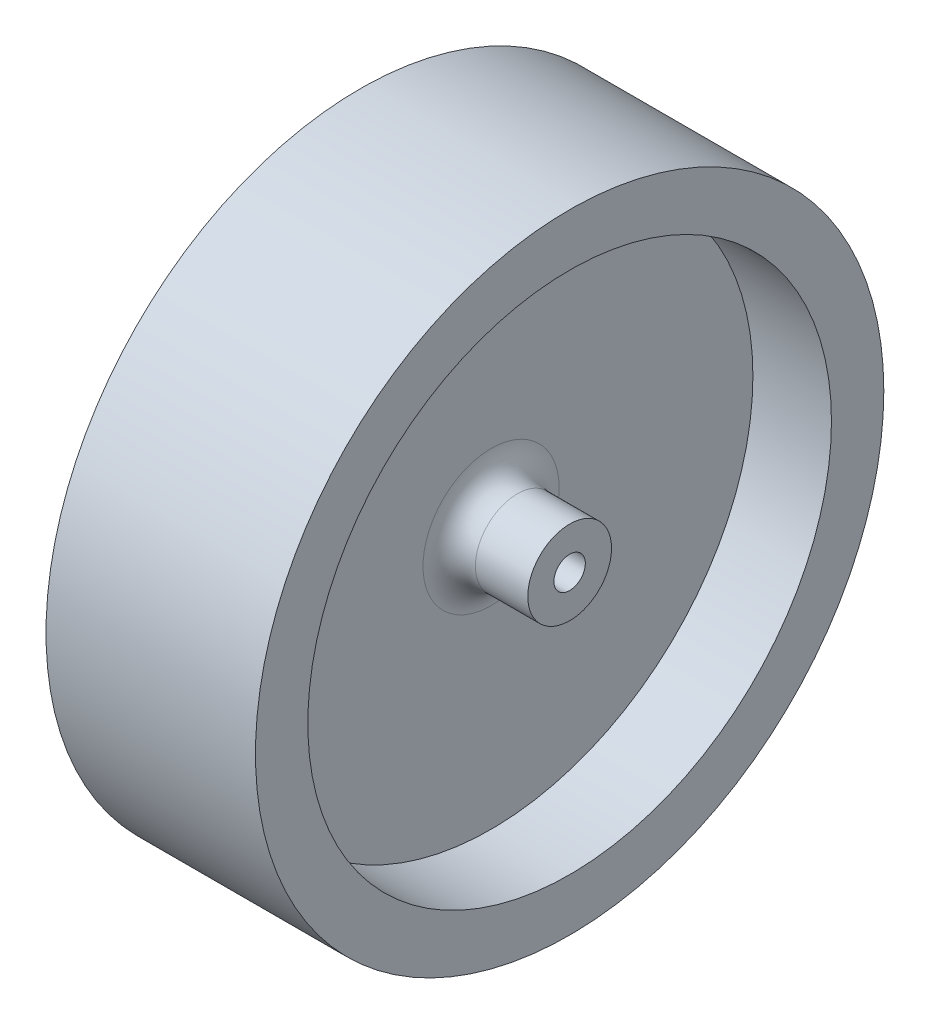
ISO-10303-21;
HEADER;
FILE_DESCRIPTION(('STEP AP214'),'2;1');
FILE_NAME('part.step','',(''),(''),'','','');
FILE_SCHEMA(('AUTOMOTIVE_DESIGN { 1 0 10303 214 1 1 1 1 }'));
ENDSEC;
DATA;
#1=APPLICATION_CONTEXT('core data for automotive mechanical design processes');
#2=APPLICATION_PROTOCOL_DEFINITION('international standard','automotive_design',2000,#1);
#3=PRODUCT_CONTEXT('',#1,'mechanical');
#4=PRODUCT('Part','Part','',(#3));
#5=PRODUCT_RELATED_PRODUCT_CATEGORY('part','',(#4));
#6=PRODUCT_DEFINITION_FORMATION('','',#4);
#7=PRODUCT_DEFINITION_CONTEXT('part definition',#1,'design');
#8=PRODUCT_DEFINITION('design','',#6,#7);
#9=PRODUCT_DEFINITION_SHAPE('','',#8);
#10=(LENGTH_UNIT() NAMED_UNIT(*) SI_UNIT(.MILLI.,.METRE.));
#11=(NAMED_UNIT(*) PLANE_ANGLE_UNIT() SI_UNIT($,.RADIAN.));
#12=(NAMED_UNIT(*) SI_UNIT($,.STERADIAN.) SOLID_ANGLE_UNIT());
#13=UNCERTAINTY_MEASURE_WITH_UNIT(LENGTH_MEASURE(1.E-05),#10,'distance_accuracy_value','');
#14=(GEOMETRIC_REPRESENTATION_CONTEXT(3) GLOBAL_UNCERTAINTY_ASSIGNED_CONTEXT((#13)) GLOBAL_UNIT_ASSIGNED_CONTEXT((#10,
#11,#12)) REPRESENTATION_CONTEXT('',''));
#15=CARTESIAN_POINT('',(0.,0.,0.));
#16=DIRECTION('',(0.,0.,1.));
#17=DIRECTION('',(1.,0.,0.));
#18=AXIS2_PLACEMENT_3D('',#15,#16,#17);
#19=CARTESIAN_POINT('',(40.,0.,0.));
#20=DIRECTION('',(-1.,0.,0.));
#21=DIRECTION('',(0.,0.,1.));
#22=AXIS2_PLACEMENT_3D('',#19,#20,#21);
#23=CYLINDRICAL_SURFACE('',#22,60.);
#24=CARTESIAN_POINT('',(40.,0.,0.));
#25=DIRECTION('',(1.,0.,0.));
#26=DIRECTION('',(0.,0.,-1.));
#27=AXIS2_PLACEMENT_3D('',#24,#25,#26);
#28=CIRCLE('',#27,60.);
#29=CARTESIAN_POINT('',(40.,0.,-60.));
#30=VERTEX_POINT('',#29);
#31=EDGE_CURVE('E63',#30,#30,#28,.T.);
#32=ORIENTED_EDGE('',*,*,#31,.F.);
#33=EDGE_LOOP('',(#32));
#34=FACE_BOUND('',#33,.T.);
#35=CARTESIAN_POINT('',(0.,0.,0.));
#36=DIRECTION('',(1.,0.,0.));
#37=DIRECTION('',(0.,0.,-1.));
#38=AXIS2_PLACEMENT_3D('',#35,#36,#37);
#39=CIRCLE('',#38,60.);
#40=CARTESIAN_POINT('',(0.,0.,-60.));
#41=VERTEX_POINT('',#40);
#42=EDGE_CURVE('E64',#41,#41,#39,.T.);
#43=ORIENTED_EDGE('',*,*,#42,.T.);
#44=EDGE_LOOP('',(#43));
#45=FACE_BOUND('',#44,.T.);
#46=ADVANCED_FACE('F39',(#34,#45),#23,.T.);
#47=CARTESIAN_POINT('',(40.,0.,0.));
#48=DIRECTION('',(1.,0.,0.));
#49=DIRECTION('',(0.,0.,-1.));
#50=AXIS2_PLACEMENT_3D('',#47,#48,#49);
#51=PLANE('',#50);
#52=CARTESIAN_POINT('',(40.,0.,0.));
#53=DIRECTION('',(1.,0.,0.));
#54=DIRECTION('',(0.,0.,-1.));
#55=AXIS2_PLACEMENT_3D('',#52,#53,#54);
#56=CIRCLE('',#55,50.);
#57=CARTESIAN_POINT('',(40.,0.,-50.));
#58=VERTEX_POINT('',#57);
#59=EDGE_CURVE('E72',#58,#58,#56,.T.);
#60=ORIENTED_EDGE('',*,*,#59,.F.);
#61=EDGE_LOOP('',(#60));
#62=FACE_BOUND('',#61,.T.);
#63=ORIENTED_EDGE('',*,*,#31,.T.);
#64=EDGE_LOOP('',(#63));
#65=FACE_BOUND('',#64,.T.);
#66=ADVANCED_FACE('F130',(#62,#65),#51,.T.);
#67=CARTESIAN_POINT('',(0.,0.,0.));
#68=DIRECTION('',(1.,0.,0.));
#69=DIRECTION('',(0.,0.,-1.));
#70=AXIS2_PLACEMENT_3D('',#67,#68,#69);
#71=PLANE('',#70);
#72=CARTESIAN_POINT('',(0.,0.,0.));
#73=DIRECTION('',(-1.,0.,0.));
#74=DIRECTION('',(0.,0.,1.));
#75=AXIS2_PLACEMENT_3D('',#72,#73,#74);
#76=CIRCLE('',#75,50.);
#77=CARTESIAN_POINT('',(0.,0.,50.));
#78=VERTEX_POINT('',#77);
#79=EDGE_CURVE('E80',#78,#78,#76,.T.);
#80=ORIENTED_EDGE('',*,*,#79,.F.);
#81=EDGE_LOOP('',(#80));
#82=FACE_BOUND('',#81,.T.);
#83=ORIENTED_EDGE('',*,*,#42,.F.);
#84=EDGE_LOOP('',(#83));
#85=FACE_BOUND('',#84,.T.);
#86=ADVANCED_FACE('F136',(#82,#85),#71,.F.);
#87=CARTESIAN_POINT('',(25.,0.,0.));
#88=DIRECTION('',(1.,0.,0.));
#89=DIRECTION('',(0.,0.,-1.));
#90=AXIS2_PLACEMENT_3D('',#87,#88,#89);
#91=CYLINDRICAL_SURFACE('',#90,50.);
#92=CARTESIAN_POINT('',(25.,0.,0.));
#93=DIRECTION('',(1.,0.,0.));
#94=DIRECTION('',(0.,0.,-1.));
#95=AXIS2_PLACEMENT_3D('',#92,#93,#94);
#96=CIRCLE('',#95,50.);
#97=CARTESIAN_POINT('',(25.,0.,-50.));
#98=VERTEX_POINT('',#97);
#99=EDGE_CURVE('E68',#98,#98,#96,.T.);
#100=ORIENTED_EDGE('',*,*,#99,.F.);
#101=EDGE_LOOP('',(#100));
#102=FACE_BOUND('',#101,.T.);
#103=ORIENTED_EDGE('',*,*,#59,.T.);
#104=EDGE_LOOP('',(#103));
#105=FACE_BOUND('',#104,.T.);
#106=ADVANCED_FACE('F156',(#102,#105),#91,.F.);
#107=CARTESIAN_POINT('',(25.,0.,0.));
#108=DIRECTION('',(1.,0.,0.));
#109=DIRECTION('',(0.,0.,-1.));
#110=AXIS2_PLACEMENT_3D('',#107,#108,#109);
#111=PLANE('',#110);
#112=CARTESIAN_POINT('',(25.,0.,0.));
#113=DIRECTION('',(1.,0.,0.));
#114=DIRECTION('',(0.,0.,-1.));
#115=AXIS2_PLACEMENT_3D('',#112,#113,#114);
#116=CIRCLE('',#115,13.);
#117=CARTESIAN_POINT('',(25.,0.,-13.));
#118=VERTEX_POINT('',#117);
#119=EDGE_CURVE('E52',#118,#118,#116,.F.);
#120=ORIENTED_EDGE('',*,*,#119,.T.);
#121=EDGE_LOOP('',(#120));
#122=FACE_BOUND('',#121,.T.);
#123=ORIENTED_EDGE('',*,*,#99,.T.);
#124=EDGE_LOOP('',(#123));
#125=FACE_BOUND('',#124,.T.);
#126=ADVANCED_FACE('F152',(#122,#125),#111,.T.);
#127=CARTESIAN_POINT('',(15.,0.,0.));
#128=DIRECTION('',(-1.,0.,0.));
#129=DIRECTION('',(0.,0.,1.));
#130=AXIS2_PLACEMENT_3D('',#127,#128,#129);
#131=CYLINDRICAL_SURFACE('',#130,50.);
#132=CARTESIAN_POINT('',(15.,0.,0.));
#133=DIRECTION('',(-1.,0.,0.));
#134=DIRECTION('',(0.,0.,1.));
#135=AXIS2_PLACEMENT_3D('',#132,#133,#134);
#136=CIRCLE('',#135,50.);
#137=CARTESIAN_POINT('',(15.,0.,50.));
#138=VERTEX_POINT('',#137);
#139=EDGE_CURVE('E76',#138,#138,#136,.T.);
#140=ORIENTED_EDGE('',*,*,#139,.F.);
#141=EDGE_LOOP('',(#140));
#142=FACE_BOUND('',#141,.T.);
#143=ORIENTED_EDGE('',*,*,#79,.T.);
#144=EDGE_LOOP('',(#143));
#145=FACE_BOUND('',#144,.T.);
#146=ADVANCED_FACE('F155',(#142,#145),#131,.F.);
#147=CARTESIAN_POINT('',(15.,0.,0.));
#148=DIRECTION('',(-1.,0.,0.));
#149=DIRECTION('',(0.,0.,1.));
#150=AXIS2_PLACEMENT_3D('',#147,#148,#149);
#151=PLANE('',#150);
#152=CARTESIAN_POINT('',(15.,0.,0.));
#153=DIRECTION('',(-1.,0.,0.));
#154=DIRECTION('',(0.,0.,1.));
#155=AXIS2_PLACEMENT_3D('',#152,#153,#154);
#156=CIRCLE('',#155,13.);
#157=CARTESIAN_POINT('',(15.,0.,13.));
#158=VERTEX_POINT('',#157);
#159=EDGE_CURVE('E10',#158,#158,#156,.F.);
#160=ORIENTED_EDGE('',*,*,#159,.T.);
#161=EDGE_LOOP('',(#160));
#162=FACE_BOUND('',#161,.T.);
#163=ORIENTED_EDGE('',*,*,#139,.T.);
#164=EDGE_LOOP('',(#163));
#165=FACE_BOUND('',#164,.T.);
#166=ADVANCED_FACE('F172',(#162,#165),#151,.T.);
#167=CARTESIAN_POINT('',(0.,0.,0.));
#168=DIRECTION('',(1.,0.,0.));
#169=DIRECTION('',(0.,0.,-1.));
#170=AXIS2_PLACEMENT_3D('',#167,#168,#169);
#171=CYLINDRICAL_SURFACE('',#170,8.);
#172=CARTESIAN_POINT('',(10.,0.,0.));
#173=DIRECTION('',(-1.,0.,0.));
#174=DIRECTION('',(0.,0.,1.));
#175=AXIS2_PLACEMENT_3D('',#172,#173,#174);
#176=CIRCLE('',#175,8.);
#177=CARTESIAN_POINT('',(10.,0.,8.));
#178=VERTEX_POINT('',#177);
#179=EDGE_CURVE('E47',#178,#178,#176,.T.);
#180=ORIENTED_EDGE('',*,*,#179,.T.);
#181=EDGE_LOOP('',(#180));
#182=FACE_BOUND('',#181,.T.);
#183=CARTESIAN_POINT('',(0.,0.,0.));
#184=DIRECTION('',(-1.,0.,0.));
#185=DIRECTION('',(0.,0.,1.));
#186=AXIS2_PLACEMENT_3D('',#183,#184,#185);
#187=CIRCLE('',#186,8.);
#188=CARTESIAN_POINT('',(0.,0.,8.));
#189=VERTEX_POINT('',#188);
#190=EDGE_CURVE('E84',#189,#189,#187,.T.);
#191=ORIENTED_EDGE('',*,*,#190,.F.);
#192=EDGE_LOOP('',(#191));
#193=FACE_BOUND('',#192,.T.);
#194=ADVANCED_FACE('F127',(#182,#193),#171,.T.);
#195=CARTESIAN_POINT('',(0.,0.,0.));
#196=DIRECTION('',(-1.,0.,0.));
#197=DIRECTION('',(0.,0.,1.));
#198=AXIS2_PLACEMENT_3D('',#195,#196,#197);
#199=PLANE('',#198);
#200=CARTESIAN_POINT('',(0.,0.,0.));
#201=DIRECTION('',(1.,0.,0.));
#202=DIRECTION('',(0.,0.,-1.));
#203=AXIS2_PLACEMENT_3D('',#200,#201,#202);
#204=CIRCLE('',#203,3.);
#205=CARTESIAN_POINT('',(0.,0.,-3.));
#206=VERTEX_POINT('',#205);
#207=EDGE_CURVE('E95',#206,#206,#204,.T.);
#208=ORIENTED_EDGE('',*,*,#207,.T.);
#209=EDGE_LOOP('',(#208));
#210=FACE_BOUND('',#209,.T.);
#211=ORIENTED_EDGE('',*,*,#190,.T.);
#212=EDGE_LOOP('',(#211));
#213=FACE_BOUND('',#212,.T.);
#214=ADVANCED_FACE('F104',(#210,#213),#199,.T.);
#215=CARTESIAN_POINT('',(40.,0.,0.));
#216=DIRECTION('',(-1.,0.,0.));
#217=DIRECTION('',(0.,0.,1.));
#218=AXIS2_PLACEMENT_3D('',#215,#216,#217);
#219=CYLINDRICAL_SURFACE('',#218,8.);
#220=CARTESIAN_POINT('',(30.,0.,0.));
#221=DIRECTION('',(1.,0.,0.));
#222=DIRECTION('',(0.,0.,-1.));
#223=AXIS2_PLACEMENT_3D('',#220,#221,#222);
#224=CIRCLE('',#223,8.);
#225=CARTESIAN_POINT('',(30.,0.,-8.));
#226=VERTEX_POINT('',#225);
#227=EDGE_CURVE('E57',#226,#226,#224,.T.);
#228=ORIENTED_EDGE('',*,*,#227,.T.);
#229=EDGE_LOOP('',(#228));
#230=FACE_BOUND('',#229,.T.);
#231=CARTESIAN_POINT('',(40.,0.,0.));
#232=DIRECTION('',(1.,0.,0.));
#233=DIRECTION('',(0.,0.,-1.));
#234=AXIS2_PLACEMENT_3D('',#231,#232,#233);
#235=CIRCLE('',#234,8.);
#236=CARTESIAN_POINT('',(40.,0.,-8.));
#237=VERTEX_POINT('',#236);
#238=EDGE_CURVE('E91',#237,#237,#235,.T.);
#239=ORIENTED_EDGE('',*,*,#238,.F.);
#240=EDGE_LOOP('',(#239));
#241=FACE_BOUND('',#240,.T.);
#242=ADVANCED_FACE('F117',(#230,#241),#219,.T.);
#243=CARTESIAN_POINT('',(40.,0.,0.));
#244=DIRECTION('',(1.,0.,0.));
#245=DIRECTION('',(0.,0.,-1.));
#246=AXIS2_PLACEMENT_3D('',#243,#244,#245);
#247=PLANE('',#246);
#248=CARTESIAN_POINT('',(40.,0.,0.));
#249=DIRECTION('',(1.,0.,0.));
#250=DIRECTION('',(0.,0.,-1.));
#251=AXIS2_PLACEMENT_3D('',#248,#249,#250);
#252=CIRCLE('',#251,3.);
#253=CARTESIAN_POINT('',(40.,0.,-3.));
#254=VERTEX_POINT('',#253);
#255=EDGE_CURVE('E96',#254,#254,#252,.T.);
#256=ORIENTED_EDGE('',*,*,#255,.F.);
#257=EDGE_LOOP('',(#256));
#258=FACE_BOUND('',#257,.T.);
#259=ORIENTED_EDGE('',*,*,#238,.T.);
#260=EDGE_LOOP('',(#259));
#261=FACE_BOUND('',#260,.T.);
#262=ADVANCED_FACE('F111',(#258,#261),#247,.T.);
#263=CARTESIAN_POINT('',(0.,0.,0.));
#264=DIRECTION('',(1.,0.,0.));
#265=DIRECTION('',(0.,0.,-1.));
#266=AXIS2_PLACEMENT_3D('',#263,#264,#265);
#267=CYLINDRICAL_SURFACE('',#266,3.);
#268=ORIENTED_EDGE('',*,*,#207,.F.);
#269=EDGE_LOOP('',(#268));
#270=FACE_BOUND('',#269,.T.);
#271=ORIENTED_EDGE('',*,*,#255,.T.);
#272=EDGE_LOOP('',(#271));
#273=FACE_BOUND('',#272,.T.);
#274=ADVANCED_FACE('F107',(#270,#273),#267,.F.);
#275=CARTESIAN_POINT('',(30.,0.,0.));
#276=DIRECTION('',(1.,0.,0.));
#277=DIRECTION('',(0.,0.,-1.));
#278=AXIS2_PLACEMENT_3D('',#275,#276,#277);
#279=TOROIDAL_SURFACE('',#278,13.,5.);
#280=ORIENTED_EDGE('',*,*,#119,.F.);
#281=EDGE_LOOP('',(#280));
#282=FACE_BOUND('',#281,.T.);
#283=ORIENTED_EDGE('',*,*,#227,.F.);
#284=EDGE_LOOP('',(#283));
#285=FACE_BOUND('',#284,.T.);
#286=ADVANCED_FACE('F110',(#282,#285),#279,.F.);
#287=CARTESIAN_POINT('',(10.,0.,0.));
#288=DIRECTION('',(-1.,0.,0.));
#289=DIRECTION('',(0.,0.,1.));
#290=AXIS2_PLACEMENT_3D('',#287,#288,#289);
#291=TOROIDAL_SURFACE('',#290,13.,5.);
#292=ORIENTED_EDGE('',*,*,#159,.F.);
#293=EDGE_LOOP('',(#292));
#294=FACE_BOUND('',#293,.T.);
#295=ORIENTED_EDGE('',*,*,#179,.F.);
#296=EDGE_LOOP('',(#295));
#297=FACE_BOUND('',#296,.T.);
#298=ADVANCED_FACE('F41',(#294,#297),#291,.F.);
#299=CLOSED_SHELL('',(#46,#66,#86,#106,#126,#146,#166,#194,#214,#242,#262,#274,#286,#298));
#300=MANIFOLD_SOLID_BREP('B2',#299);
#301=ADVANCED_BREP_SHAPE_REPRESENTATION('',(#18,#300),#14);
#302=SHAPE_DEFINITION_REPRESENTATION(#9,#301);
ENDSEC;
END-ISO-10303-21;
